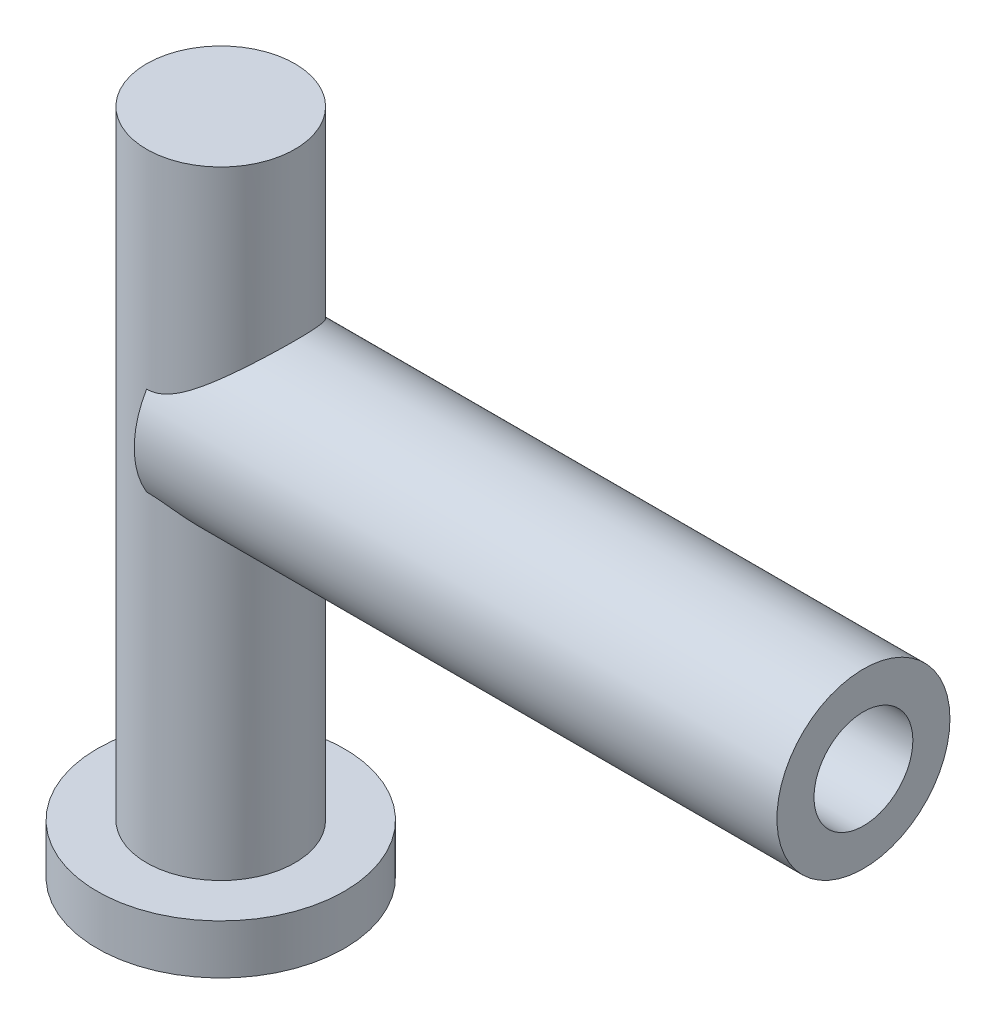
ISO-10303-21;
HEADER;
FILE_DESCRIPTION(('STEP AP214'),'2;1');
FILE_NAME('part.step','',(''),(''),'','','');
FILE_SCHEMA(('AUTOMOTIVE_DESIGN { 1 0 10303 214 1 1 1 1 }'));
ENDSEC;
DATA;
#1=APPLICATION_CONTEXT('core data for automotive mechanical design processes');
#2=APPLICATION_PROTOCOL_DEFINITION('international standard','automotive_design',2000,#1);
#3=PRODUCT_CONTEXT('',#1,'mechanical');
#4=PRODUCT('Part','Part','',(#3));
#5=PRODUCT_RELATED_PRODUCT_CATEGORY('part','',(#4));
#6=PRODUCT_DEFINITION_FORMATION('','',#4);
#7=PRODUCT_DEFINITION_CONTEXT('part definition',#1,'design');
#8=PRODUCT_DEFINITION('design','',#6,#7);
#9=PRODUCT_DEFINITION_SHAPE('','',#8);
#10=(LENGTH_UNIT() NAMED_UNIT(*) SI_UNIT(.MILLI.,.METRE.));
#11=(NAMED_UNIT(*) PLANE_ANGLE_UNIT() SI_UNIT($,.RADIAN.));
#12=(NAMED_UNIT(*) SI_UNIT($,.STERADIAN.) SOLID_ANGLE_UNIT());
#13=UNCERTAINTY_MEASURE_WITH_UNIT(LENGTH_MEASURE(1.E-05),#10,'distance_accuracy_value','');
#14=(GEOMETRIC_REPRESENTATION_CONTEXT(3) GLOBAL_UNCERTAINTY_ASSIGNED_CONTEXT((#13)) GLOBAL_UNIT_ASSIGNED_CONTEXT((#10,
#11,#12)) REPRESENTATION_CONTEXT('',''));
#15=CARTESIAN_POINT('',(0.,0.,0.));
#16=DIRECTION('',(0.,0.,1.));
#17=DIRECTION('',(1.,0.,0.));
#18=AXIS2_PLACEMENT_3D('',#15,#16,#17);
#19=CARTESIAN_POINT('',(0.,135.,0.));
#20=DIRECTION('',(0.,1.,0.));
#21=DIRECTION('',(-1.,0.,0.));
#22=AXIS2_PLACEMENT_3D('',#19,#20,#21);
#23=CYLINDRICAL_SURFACE('',#22,30.);
#24=CARTESIAN_POINT('',(-30.,12.9490466566481,0.));
#25=CARTESIAN_POINT('',(-29.9999998661981,12.9490467858325,-0.502432050357106));
#26=CARTESIAN_POINT('',(-29.9873512767924,12.9680047664271,-1.00486659291617));
#27=CARTESIAN_POINT('',(-29.9370754507124,13.0435379487039,-2.00562861223446));
#28=CARTESIAN_POINT('',(-29.8994480825663,13.1001133483795,-2.50395606736271));
#29=CARTESIAN_POINT('',(-29.8001252135495,13.2500463686513,-3.49278874290095));
#30=CARTESIAN_POINT('',(-29.7384203306489,13.3434183275139,-3.98329083644028));
#31=CARTESIAN_POINT('',(-29.5924098661005,13.5656071354852,-4.9527367018995));
#32=CARTESIAN_POINT('',(-29.5081040111715,13.6944244131837,-5.43168033398314));
#33=CARTESIAN_POINT('',(-29.3192451350848,13.9851261764357,-6.3726831529905));
#34=CARTESIAN_POINT('',(-29.2147907649452,14.1468497498239,-6.83481207132658));
#35=CARTESIAN_POINT('',(-28.987567335659,14.5018880191012,-7.74207070686117));
#36=CARTESIAN_POINT('',(-28.864798371266,14.6952025515497,-8.18720051199242));
#37=CARTESIAN_POINT('',(-28.6033482003015,15.1115085441732,-9.05844037609497));
#38=CARTESIAN_POINT('',(-28.4646675126728,15.3344990365384,-9.48455105472425));
#39=CARTESIAN_POINT('',(-28.1739113247129,15.8083268670823,-10.3162415378409));
#40=CARTESIAN_POINT('',(-28.0218342454823,16.059167488588,-10.7218189133778));
#41=CARTESIAN_POINT('',(-27.6935578417576,16.6093419870822,-11.544666651525));
#42=CARTESIAN_POINT('',(-27.5164065024113,16.9109841412892,-11.9600134544702));
#43=CARTESIAN_POINT('',(-27.1528656210948,17.5430427283214,-12.7638755092378));
#44=CARTESIAN_POINT('',(-26.9664756598522,17.8734604675724,-13.1523895414017));
#45=CARTESIAN_POINT('',(-26.5877396332004,18.5618771047251,-13.9021114634373));
#46=CARTESIAN_POINT('',(-26.3953859507486,18.9199122239919,-14.2632822184455));
#47=CARTESIAN_POINT('',(-26.0086530551826,19.6618251073262,-14.9568597365416));
#48=CARTESIAN_POINT('',(-25.8142737230125,20.0457043976866,-15.2892647981446));
#49=CARTESIAN_POINT('',(-25.396836648899,20.9008190632928,-15.9745417178036));
#50=CARTESIAN_POINT('',(-25.174096536266,21.3762773375354,-16.3223586443349));
#51=CARTESIAN_POINT('',(-24.7376939344547,22.3590808572125,-16.9764877633748));
#52=CARTESIAN_POINT('',(-24.5240335140448,22.8664333049997,-17.2827905315006));
#53=CARTESIAN_POINT('',(-24.1134541975623,23.9108542899367,-17.8511644026812));
#54=CARTESIAN_POINT('',(-23.9165127661254,24.4478811628406,-18.1132955295477));
#55=CARTESIAN_POINT('',(-23.5472211433069,25.5503367730226,-18.5908454263022));
#56=CARTESIAN_POINT('',(-23.3748591544977,26.1157517074476,-18.8062866319954));
#57=CARTESIAN_POINT('',(-23.1083554699939,27.1049974448942,-19.13202887715));
#58=CARTESIAN_POINT('',(-23.0059988256492,27.522566483143,-19.254726201792));
#59=CARTESIAN_POINT('',(-22.8211903176783,28.3689657415911,-19.4734126020971));
#60=CARTESIAN_POINT('',(-22.7387352052499,28.7977941110838,-19.5694060373963));
#61=CARTESIAN_POINT('',(-22.5966842761104,29.6638847339317,-19.7332623242764));
#62=CARTESIAN_POINT('',(-22.5370547106276,30.1011335239383,-19.8011667190628));
#63=CARTESIAN_POINT('',(-22.4427751867479,30.9818691856146,-19.9079619855319));
#64=CARTESIAN_POINT('',(-22.4081253652476,31.4253560914575,-19.9468526982109));
#65=CARTESIAN_POINT('',(-22.3651578047493,32.3170728539821,-19.995018995311));
#66=CARTESIAN_POINT('',(-22.3569497015248,32.7653147463807,-20.004171276088));
#67=CARTESIAN_POINT('',(-22.3675301691013,33.6610773153886,-19.9923398271623));
#68=CARTESIAN_POINT('',(-22.3863188316052,34.1085979895429,-19.971355995093));
#69=CARTESIAN_POINT('',(-22.4501086857202,34.9996717520401,-19.8996205096492));
#70=CARTESIAN_POINT('',(-22.4951293541334,35.4432216434202,-19.8488467375743));
#71=CARTESIAN_POINT('',(-22.6095581655225,36.3228215840411,-19.7184018881212));
#72=CARTESIAN_POINT('',(-22.6789667736164,36.7588714900785,-19.6387302596127));
#73=CARTESIAN_POINT('',(-22.8360020403641,37.6016526517218,-19.4558684710411));
#74=CARTESIAN_POINT('',(-22.9226794986437,38.0088246899546,-19.3538839737256));
#75=CARTESIAN_POINT('',(-23.1133089528255,38.8122825298098,-19.1258219416928));
#76=CARTESIAN_POINT('',(-23.2172676308142,39.208564051083,-18.9997350845369));
#77=CARTESIAN_POINT('',(-23.5509005263235,40.3789773277666,-18.5870898788947));
#78=CARTESIAN_POINT('',(-23.8024209013306,41.1351284508132,-18.2660472919538));
#79=CARTESIAN_POINT('',(-24.2342569329525,42.3013339233787,-17.6854431992285));
#80=CARTESIAN_POINT('',(-24.4030773177829,42.7293714716125,-17.4522559964646));
#81=CARTESIAN_POINT('',(-24.7497432705651,43.5647943008783,-16.9570483876589));
#82=CARTESIAN_POINT('',(-24.9275896995493,43.972177604177,-16.6950252280375));
#83=CARTESIAN_POINT('',(-25.2885468949721,44.7658013210802,-16.1430567151301));
#84=CARTESIAN_POINT('',(-25.4716632378859,45.1520179805102,-15.8530809594392));
#85=CARTESIAN_POINT('',(-25.8393965051977,45.9020855877797,-15.246358714758));
#86=CARTESIAN_POINT('',(-26.0240135285329,46.2659350472229,-14.9296104475491));
#87=CARTESIAN_POINT('',(-26.4310497738323,47.0463498537771,-14.1989483888887));
#88=CARTESIAN_POINT('',(-26.6530303956694,47.4573500244591,-13.7788159652825));
#89=CARTESIAN_POINT('',(-27.0885965336176,48.2427979996002,-12.9014676729698));
#90=CARTESIAN_POINT('',(-27.3021805000214,48.6172390753667,-12.4442450060577));
#91=CARTESIAN_POINT('',(-27.7153401348638,49.326564978796,-11.4946861176089));
#92=CARTESIAN_POINT('',(-27.9149260225621,49.6614787878065,-11.0023760522687));
#93=CARTESIAN_POINT('',(-28.2949676279155,50.2888118731227,-9.98447354240779));
#94=CARTESIAN_POINT('',(-28.4754286055528,50.5812428418608,-9.45889031296221));
#95=CARTESIAN_POINT('',(-28.7791644068811,51.0672372049617,-8.4833461227497));
#96=CARTESIAN_POINT('',(-28.9067147978732,51.2689442319853,-8.03875717640116));
#97=CARTESIAN_POINT('',(-29.1437173052015,51.6406698194511,-7.13185034835575));
#98=CARTESIAN_POINT('',(-29.2531715370476,51.8106920842584,-6.6695345467911));
#99=CARTESIAN_POINT('',(-29.4516277514227,52.1170404523184,-5.72992272771891));
#100=CARTESIAN_POINT('',(-29.5406434674396,52.2533891869002,-5.25263701566193));
#101=CARTESIAN_POINT('',(-29.6963305492252,52.4907990479044,-4.28575432400348));
#102=CARTESIAN_POINT('',(-29.7630015712691,52.5918596314958,-3.79615715514136));
#103=CARTESIAN_POINT('',(-29.8726578949709,52.7576199706144,-2.80597314349126));
#104=CARTESIAN_POINT('',(-29.9155383206477,52.8221587517845,-2.30534759903097));
#105=CARTESIAN_POINT('',(-29.9760956021539,52.9132012089964,-1.29911991465958));
#106=CARTESIAN_POINT('',(-29.9937724250504,52.9397048353385,-0.793517768246544));
#107=CARTESIAN_POINT('',(-30.0034717951188,52.9542546895085,0.218464736427038));
#108=CARTESIAN_POINT('',(-29.9954953996663,52.9423025024098,0.724845061752664));
#109=CARTESIAN_POINT('',(-29.9540933231667,52.8801341121421,1.73418156784463));
#110=CARTESIAN_POINT('',(-29.9206687283027,52.8299195420926,2.23713789383012));
#111=CARTESIAN_POINT('',(-29.8324414506934,52.6968779257794,3.20042176411032));
#112=CARTESIAN_POINT('',(-29.7793090042602,52.6165950018563,3.66125811656817));
#113=CARTESIAN_POINT('',(-29.6529106481444,52.4246807677952,4.57350157570507));
#114=CARTESIAN_POINT('',(-29.5796458717002,52.3130512221345,5.02490921158322));
#115=CARTESIAN_POINT('',(-29.4144446665675,52.0597444088362,5.91571607198155));
#116=CARTESIAN_POINT('',(-29.3225070223762,51.9180651850998,6.35511451265424));
#117=CARTESIAN_POINT('',(-29.1217004947068,51.6061545870712,7.21966385402623));
#118=CARTESIAN_POINT('',(-29.0128307093883,51.4359216919141,7.64481399436504));
#119=CARTESIAN_POINT('',(-28.7730488442419,51.0573618907148,8.50426678457441));
#120=CARTESIAN_POINT('',(-28.641201691667,50.8473533829713,8.9375669837223));
#121=CARTESIAN_POINT('',(-28.363103021114,50.3988764552911,9.78432512725704));
#122=CARTESIAN_POINT('',(-28.2168510697156,50.1604071789635,10.1977824740429));
#123=CARTESIAN_POINT('',(-27.9124418593604,49.6566708585115,11.0036909497809));
#124=CARTESIAN_POINT('',(-27.7542793038351,49.391391874134,11.3961325988641));
#125=CARTESIAN_POINT('',(-27.4287361682711,48.8357162183836,12.1587990167243));
#126=CARTESIAN_POINT('',(-27.2613545613897,48.5453167469595,12.529021301013));
#127=CARTESIAN_POINT('',(-26.8930879740092,47.8929995513677,13.3031347178692));
#128=CARTESIAN_POINT('',(-26.6910905163228,47.5270341316246,13.7030923841241));
#129=CARTESIAN_POINT('',(-26.2826982946006,46.765113154077,14.4709683638239));
#130=CARTESIAN_POINT('',(-26.0763029510258,46.3691536259622,14.8388824217615));
#131=CARTESIAN_POINT('',(-25.6635739697582,45.5484489806615,15.5417880165119));
#132=CARTESIAN_POINT('',(-25.4572404691787,45.1236844957861,15.876757023597));
#133=CARTESIAN_POINT('',(-25.0497261492331,44.2468112719767,16.5122275702686));
#134=CARTESIAN_POINT('',(-24.8485448051984,43.7947053332408,16.81273263041));
#135=CARTESIAN_POINT('',(-24.4733023029991,42.9035294042009,17.3538627139578));
#136=CARTESIAN_POINT('',(-24.2983863656876,42.4665896271533,17.5974024349064));
#137=CARTESIAN_POINT('',(-23.9619407246742,41.5714918573938,18.0528546349536));
#138=CARTESIAN_POINT('',(-23.8004112149102,41.113333557425,18.2647666558762));
#139=CARTESIAN_POINT('',(-23.4959190621918,40.1777080845106,18.6548371117046));
#140=CARTESIAN_POINT('',(-23.352929353255,39.700270424661,18.8330449293941));
#141=CARTESIAN_POINT('',(-23.0904591353034,38.7273214579476,19.1539484457238));
#142=CARTESIAN_POINT('',(-22.9709732247938,38.2318143347954,19.2966523056608));
#143=CARTESIAN_POINT('',(-22.7795445121487,37.3160293004886,19.5220414226083));
#144=CARTESIAN_POINT('',(-22.7029160837044,36.8982466693676,19.6109049179647));
#145=CARTESIAN_POINT('',(-22.5714513943608,36.0545153501045,19.7620762933325));
#146=CARTESIAN_POINT('',(-22.5166125085731,35.6285676520558,19.82438737206));
#147=CARTESIAN_POINT('',(-22.4307802243878,34.771537847478,19.9214537495162));
#148=CARTESIAN_POINT('',(-22.3997648547817,34.3404608450153,19.9562344390175));
#149=CARTESIAN_POINT('',(-22.3627151772862,33.4758656456945,19.9977438544737));
#150=CARTESIAN_POINT('',(-22.3566812339736,33.0423474133017,20.0044721710347));
#151=CARTESIAN_POINT('',(-22.3698449862022,32.1759313693192,19.9897505651309));
#152=CARTESIAN_POINT('',(-22.389057085506,31.7430340530927,19.9682845568072));
#153=CARTESIAN_POINT('',(-22.4519644396443,30.8813440408061,19.89752521375));
#154=CARTESIAN_POINT('',(-22.4956594937703,30.4525513111264,19.84823210714));
#155=CARTESIAN_POINT('',(-22.6059284972836,29.6014646871913,19.7225495457303));
#156=CARTESIAN_POINT('',(-22.672528474229,29.1791787596563,19.6461292623078));
#157=CARTESIAN_POINT('',(-22.8262602119976,28.3439654828719,19.4672984586528));
#158=CARTESIAN_POINT('',(-22.9133946099072,27.9310393431043,19.3648846001243));
#159=CARTESIAN_POINT('',(-23.1310818906606,27.0078149623273,19.1046848410163));
#160=CARTESIAN_POINT('',(-23.2670175183131,26.5008858880061,18.9394160062732));
#161=CARTESIAN_POINT('',(-23.5616278122302,25.5075701502435,18.5716220555324));
#162=CARTESIAN_POINT('',(-23.7203087439171,25.021189194942,18.369086669714));
#163=CARTESIAN_POINT('',(-24.0548494900775,24.0701868725302,17.928768029319));
#164=CARTESIAN_POINT('',(-24.2307275976469,23.6055894714747,17.6909470983742));
#165=CARTESIAN_POINT('',(-24.5941802563021,22.6998616789805,17.1820850766219));
#166=CARTESIAN_POINT('',(-24.781754189423,22.2587300499744,16.9110457402246));
#167=CARTESIAN_POINT('',(-25.1672255632098,21.3930011527054,16.3319905343255));
#168=CARTESIAN_POINT('',(-25.3652486390897,20.9688498081769,16.0233924051234));
#169=CARTESIAN_POINT('',(-25.7637225763061,20.146755786134,15.3745104302452));
#170=CARTESIAN_POINT('',(-25.9641734317233,19.7488130447341,15.03422666181));
#171=CARTESIAN_POINT('',(-26.3632502502893,18.9801936222388,14.3228973596636));
#172=CARTESIAN_POINT('',(-26.5618756733661,18.6095247966881,13.951843028237));
#173=CARTESIAN_POINT('',(-26.9531887772777,17.8970370296265,13.180017889376));
#174=CARTESIAN_POINT('',(-27.1458759630328,17.5552204894655,12.7792446136651));
#175=CARTESIAN_POINT('',(-27.5484327444244,16.8552738161282,11.88929534125));
#176=CARTESIAN_POINT('',(-27.7567878541468,16.5018678353836,11.3956949938792));
#177=CARTESIAN_POINT('',(-28.1549839321457,15.8384212548499,10.3729470334891));
#178=CARTESIAN_POINT('',(-28.3448221999975,15.5283869773681,9.84379425458729));
#179=CARTESIAN_POINT('',(-28.7002669540513,14.9558362185735,8.75345833781633));
#180=CARTESIAN_POINT('',(-28.8659031307225,14.6932614198746,8.19231563994949));
#181=CARTESIAN_POINT('',(-29.1680076078479,14.2192293488792,7.04137086874957));
#182=CARTESIAN_POINT('',(-29.3044861493111,14.007754125496,6.45157894748345));
#183=CARTESIAN_POINT('',(-29.5171038312657,13.6806485441157,5.38222751658731));
#184=CARTESIAN_POINT('',(-29.5999120726272,13.5541627082134,4.90728446450017));
#185=CARTESIAN_POINT('',(-29.7432935523992,13.3360332784478,3.94618639128294));
#186=CARTESIAN_POINT('',(-29.8038703786016,13.2443840624305,3.46003319276104));
#187=CARTESIAN_POINT('',(-29.9013488891663,13.0972532954016,2.48023551916964));
#188=CARTESIAN_POINT('',(-29.9382651667603,13.0417494504933,1.98659585428407));
#189=CARTESIAN_POINT('',(-29.9875912480541,12.9676453750214,0.995305041117392));
#190=CARTESIAN_POINT('',(-30.0000001325293,12.9490465286922,0.497653743070654));
#191=CARTESIAN_POINT('',(-30.,12.9490466566481,0.));
#192=B_SPLINE_CURVE_WITH_KNOTS('',3,(#24,#25,#26,#27,#28,#29,#30,#31,#32,#33,#34,#35,#36,#37,
#38,#39,#40,#41,#42,#43,#44,#45,#46,#47,#48,#49,#50,#51,#52,#53,#54,#55,#56,#57,#58,#59,#60,#61,
#62,#63,#64,#65,#66,#67,#68,#69,#70,#71,#72,#73,#74,#75,#76,#77,#78,#79,#80,#81,#82,#83,#84,#85,
#86,#87,#88,#89,#90,#91,#92,#93,#94,#95,#96,#97,#98,#99,#100,#101,#102,#103,#104,#105,#106,#107,
#108,#109,#110,#111,#112,#113,#114,#115,#116,#117,#118,#119,#120,#121,#122,#123,#124,#125,#126,
#127,#128,#129,#130,#131,#132,#133,#134,#135,#136,#137,#138,#139,#140,#141,#142,#143,#144,#145,
#146,#147,#148,#149,#150,#151,#152,#153,#154,#155,#156,#157,#158,#159,#160,#161,#162,#163,#164,
#165,#166,#167,#168,#169,#170,#171,#172,#173,#174,#175,#176,#177,#178,#179,#180,#181,#182,#183,
#184,#185,#186,#187,#188,#189,#190,#191),.UNSPECIFIED.,.T.,.F.,(4,2,2,2,2,2,2,2,2,2,2,2,2,2,2,2,
2,2,2,2,2,2,2,2,2,2,2,2,2,2,2,2,2,2,2,2,2,2,2,2,2,2,2,2,2,2,2,2,2,2,2,2,2,2,2,2,2,2,2,2,2,2,2,2,
2,2,2,2,2,2,2,2,2,2,2,2,2,2,2,2,2,2,2,4),(0.,1.50678860030269,3.01358513141216,4.52096938721657,
6.02837187047945,7.52857302893605,9.02876642612416,10.5289109101102,12.0292324383504,
13.6567444840869,15.284330458243,16.9140886133164,18.5439431024577,20.431131930561,
22.3187484658921,24.2037789087041,26.0879015235946,27.4279650999174,28.7678097709498,
30.1056656880386,31.4435289369311,32.7869323000986,34.1303402265694,35.4747468830929,
36.8191791810432,38.1037263431644,39.3887713582513,41.9574635192448,43.5039572638652,
45.0505988133526,46.5989419535986,48.1473880150574,50.029943114075,51.9128440463346,
53.7943557465544,55.6753486185392,57.1876211138398,58.699716693543,60.2107932404063,
61.7218930308517,63.2396023156496,64.7573135836025,66.2749622952646,67.7925462340978,
69.2033177886317,70.6140099478306,72.0247939649324,73.4356531490234,74.9318700392892,
76.4281319624119,77.9250632379934,79.4221615843148,81.1559974776003,82.8900632805819,
84.6253068106235,86.3603729242013,87.9487273830719,89.5371048494667,91.1231367124568,
92.7088036566569,94.0093258243475,95.3096912764256,96.6088560233589,97.9080397301251,
99.2079649891922,100.507879591774,101.809276234171,103.110840096639,104.759184673476,
106.407984179069,108.058557042328,109.70904276911,111.389510486189,113.069974106853,
114.750919862111,116.432005383304,118.354868197109,120.278011015838,122.198774401875,
124.118862046836,125.61242765333,127.105752116315,128.598154645697,130.090613151129),.UNSPECIFIED.);
#193=CARTESIAN_POINT('',(-30.,12.9490466566481,0.));
#194=VERTEX_POINT('',#193);
#195=EDGE_CURVE('E74',#194,#194,#192,.T.);
#196=ORIENTED_EDGE('',*,*,#195,.T.);
#197=EDGE_LOOP('',(#196));
#198=FACE_BOUND('',#197,.T.);
#199=CARTESIAN_POINT('',(0.,-115.,0.));
#200=DIRECTION('',(0.,1.,0.));
#201=DIRECTION('',(-1.,0.,0.));
#202=AXIS2_PLACEMENT_3D('',#199,#200,#201);
#203=CIRCLE('',#202,29.9999999999999);
#204=CARTESIAN_POINT('',(-29.9999999999999,-115.,0.));
#205=VERTEX_POINT('',#204);
#206=EDGE_CURVE('E79',#205,#205,#203,.T.);
#207=ORIENTED_EDGE('',*,*,#206,.T.);
#208=EDGE_LOOP('',(#207));
#209=FACE_BOUND('',#208,.T.);
#210=CARTESIAN_POINT('',(0.,135.,0.));
#211=DIRECTION('',(0.,1.,0.));
#212=DIRECTION('',(-1.,0.,0.));
#213=AXIS2_PLACEMENT_3D('',#210,#211,#212);
#214=CIRCLE('',#213,30.);
#215=CARTESIAN_POINT('',(-30.,135.,0.));
#216=VERTEX_POINT('',#215);
#217=EDGE_CURVE('E72',#216,#216,#214,.T.);
#218=ORIENTED_EDGE('',*,*,#217,.F.);
#219=EDGE_LOOP('',(#218));
#220=FACE_BOUND('',#219,.T.);
#221=DIRECTION('',(0.,1.,0.));
#222=VECTOR('',#221,1.);
#223=CARTESIAN_POINT('',(0.,135.,-30.));
#224=LINE('',#223,#222);
#225=CARTESIAN_POINT('',(0.,14.9212902793281,-30.));
#226=VERTEX_POINT('',#225);
#227=CARTESIAN_POINT('',(0.,50.9768030339681,-30.));
#228=VERTEX_POINT('',#227);
#229=EDGE_CURVE('E11',#226,#228,#224,.T.);
#230=ORIENTED_EDGE('',*,*,#229,.F.);
#231=CARTESIAN_POINT('',(0.,14.9212902793281,30.));
#232=CARTESIAN_POINT('',(0.254843531044269,14.9213181036984,30.0000085070818));
#233=CARTESIAN_POINT('',(0.50967654767122,14.9158872307409,29.9967529791874));
#234=CARTESIAN_POINT('',(1.01868418624149,14.8943149475806,29.9837781414388));
#235=CARTESIAN_POINT('',(1.27285890777247,14.8781752654775,29.9740598744879));
#236=CARTESIAN_POINT('',(1.7794638197443,14.8354369265777,29.9482508797765));
#237=CARTESIAN_POINT('',(2.03189654982502,14.8088602587778,29.9321735490007));
#238=CARTESIAN_POINT('',(2.53500628157639,14.7456421272565,29.8937689720393));
#239=CARTESIAN_POINT('',(2.78568322697466,14.709000342451,29.8714415264704));
#240=CARTESIAN_POINT('',(3.52646289702339,14.5859954926428,29.7961005029997));
#241=CARTESIAN_POINT('',(4.01346160258733,14.4858345497939,29.7343029722881));
#242=CARTESIAN_POINT('',(4.97628277782048,14.2529328348666,29.5884118712677));
#243=CARTESIAN_POINT('',(5.45209827775917,14.1201723063009,29.5043047780958));
#244=CARTESIAN_POINT('',(6.59194195786552,13.7644706047167,29.2747991649151));
#245=CARTESIAN_POINT('',(7.24934601732068,13.5272535803141,29.11857583661));
#246=CARTESIAN_POINT('',(8.53670604785339,13.0109688079425,28.7675240552719));
#247=CARTESIAN_POINT('',(9.16664964869495,12.7318824452713,28.5726784186935));
#248=CARTESIAN_POINT('',(10.4050977924853,12.1411785429944,28.1454556592296));
#249=CARTESIAN_POINT('',(11.013368111416,11.8292990858817,27.9127667352184));
#250=CARTESIAN_POINT('',(12.2040467749242,11.1846671635494,27.4131010482927));
#251=CARTESIAN_POINT('',(12.7864561596239,10.8519155391058,27.1461256660574));
#252=CARTESIAN_POINT('',(13.7894395728221,10.2548184395481,26.6474181948813));
#253=CARTESIAN_POINT('',(14.2152113646829,9.99329632426042,26.4226810871856));
#254=CARTESIAN_POINT('',(15.0531473959005,9.46519293671469,25.9544434565541));
#255=CARTESIAN_POINT('',(15.4653103899295,9.19861120495188,25.7109412231999));
#256=CARTESIAN_POINT('',(16.2764283315277,8.66264231784194,25.2052843140871));
#257=CARTESIAN_POINT('',(16.6753783076769,8.39325415557688,24.9431227319637));
#258=CARTESIAN_POINT('',(17.4600324905541,7.85379414967139,24.400303675515));
#259=CARTESIAN_POINT('',(17.8457354564748,7.58372224451693,24.1196444757221));
#260=CARTESIAN_POINT('',(18.9810103092381,6.77663826654429,23.251408341501));
#261=CARTESIAN_POINT('',(19.7109381394293,6.24129014796291,22.6362069589));
#262=CARTESIAN_POINT('',(21.1153264403236,5.18861172332638,21.3321466709154));
#263=CARTESIAN_POINT('',(21.7898099054407,4.67127399967268,20.6433185761378));
#264=CARTESIAN_POINT('',(22.9354367604098,3.77823847459407,19.3529182931281));
#265=CARTESIAN_POINT('',(23.4184587910875,3.39661287559915,18.7659725985148));
#266=CARTESIAN_POINT('',(24.3449221228651,2.65717781551231,17.5473781650169));
#267=CARTESIAN_POINT('',(24.7883646785699,2.299367599603,16.9157308442398));
#268=CARTESIAN_POINT('',(25.6311292813582,1.61384553322464,15.6092538538372));
#269=CARTESIAN_POINT('',(26.0304987779504,1.28610137877639,14.9344718847029));
#270=CARTESIAN_POINT('',(26.780879390746,0.666377041293589,13.5428583282771));
#271=CARTESIAN_POINT('',(27.1318998525571,0.374389947825666,12.8260349056735));
#272=CARTESIAN_POINT('',(27.721630428329,-0.118575106271851,11.4867477471679));
#273=CARTESIAN_POINT('',(27.9691677420232,-0.326458744832106,10.8707020744823));
#274=CARTESIAN_POINT('',(28.4253577124856,-0.710808561217858,9.61484157940477));
#275=CARTESIAN_POINT('',(28.6340145430345,-0.887278111223237,8.97502931718636));
#276=CARTESIAN_POINT('',(29.0094855008969,-1.20560663239144,7.67510290547269));
#277=CARTESIAN_POINT('',(29.1763179038312,-1.34748071966006,7.0149977652125));
#278=CARTESIAN_POINT('',(29.4656591271573,-1.59396017597902,5.67824964814185));
#279=CARTESIAN_POINT('',(29.5881674502048,-1.69856512684573,5.0016064858552));
#280=CARTESIAN_POINT('',(29.787236414982,-1.86871843236135,3.63328937606357));
#281=CARTESIAN_POINT('',(29.8635707842186,-1.93407443902697,2.94155834786363));
#282=CARTESIAN_POINT('',(29.9679416247089,-2.0234682203005,1.55178371127654));
#283=CARTESIAN_POINT('',(29.9959779907175,-2.04750590487262,0.853740089137105));
#284=CARTESIAN_POINT('',(30.0032159182893,-2.05370984792774,-0.542725184199554));
#285=CARTESIAN_POINT('',(29.9824216067935,-2.03587964488917,-1.24114679846302));
#286=CARTESIAN_POINT('',(29.8924036182641,-1.95876411607348,-2.63252126579066));
#287=CARTESIAN_POINT('',(29.8231820824125,-1.89948062312975,-3.3254743592725));
#288=CARTESIAN_POINT('',(29.6447875056795,-1.74693979237941,-4.64719380166904));
#289=CARTESIAN_POINT('',(29.5391132397213,-1.65666023282665,-5.27678381196608));
#290=CARTESIAN_POINT('',(29.2892332874524,-1.44361132668715,-6.52260790460566));
#291=CARTESIAN_POINT('',(29.145030035609,-1.3208440328538,-7.13884282813525));
#292=CARTESIAN_POINT('',(28.8200664373816,-1.04490673769371,-8.35462647132855));
#293=CARTESIAN_POINT('',(28.6393039725067,-0.891734974533519,-8.95417422173184));
#294=CARTESIAN_POINT('',(28.243463736127,-0.557400773170802,-10.1337994217654));
#295=CARTESIAN_POINT('',(28.0283838302645,-0.37623659401482,-10.7138756576559));
#296=CARTESIAN_POINT('',(27.5486587875981,0.0262539144206665,-11.8957356673395));
#297=CARTESIAN_POINT('',(27.2814862375127,0.249588225377693,-12.4958077943723));
#298=CARTESIAN_POINT('',(26.713052565081,0.72231452891295,-13.668858828762));
#299=CARTESIAN_POINT('',(26.4117906408154,0.971707134476625,-14.2418370983126));
#300=CARTESIAN_POINT('',(25.7778033901021,1.49332125840664,-15.3596202142414));
#301=CARTESIAN_POINT('',(25.4450633470028,1.76555344793882,-15.9044116967744));
#302=CARTESIAN_POINT('',(24.7506812765953,2.32952393322307,-16.9648326162562));
#303=CARTESIAN_POINT('',(24.3890333952217,2.62126617795101,-17.4804561101704));
#304=CARTESIAN_POINT('',(23.73225145794,3.1465109322211,-18.3575971183513));
#305=CARTESIAN_POINT('',(23.442897828246,3.3764882498578,-18.7255902152965));
#306=CARTESIAN_POINT('',(22.8500082202971,3.84424017373738,-19.4446449109201));
#307=CARTESIAN_POINT('',(22.5464745463998,4.08201351121223,-19.7957092419291));
#308=CARTESIAN_POINT('',(21.6152824212986,4.80536174709067,-20.8239094432575));
#309=CARTESIAN_POINT('',(20.9671981872822,5.3008318019212,-21.4758328132063));
#310=CARTESIAN_POINT('',(19.6196421938524,6.30829752793442,-22.7136273957622));
#311=CARTESIAN_POINT('',(18.9200617156107,6.82032680342157,-23.2993518370874));
#312=CARTESIAN_POINT('',(17.4728013316754,7.84847331553628,-24.4034732282811));
#313=CARTESIAN_POINT('',(16.7251362071826,8.36458925355095,-24.9218907217498));
#314=CARTESIAN_POINT('',(15.341990465066,9.28118865256894,-25.7903898466072));
#315=CARTESIAN_POINT('',(14.7155162376557,9.68339752590746,-26.1530580020466));
#316=CARTESIAN_POINT('',(13.4308563925656,10.4739230320685,-26.8354474291592));
#317=CARTESIAN_POINT('',(12.7726656125418,10.8622373853042,-27.1551616771418));
#318=CARTESIAN_POINT('',(11.4243747193044,11.6135487550861,-27.7493303175956));
#319=CARTESIAN_POINT('',(10.7343501954095,11.9766010814032,-28.0238855055935));
#320=CARTESIAN_POINT('',(9.31904267049935,12.6645102147757,-28.5257514096351));
#321=CARTESIAN_POINT('',(8.5937838860242,12.9893927453573,-28.7530940235809));
#322=CARTESIAN_POINT('',(7.39034407545808,13.4698331766859,-29.079371382842));
#323=CARTESIAN_POINT('',(6.92337281983989,13.6427263003208,-29.1942183946081));
#324=CARTESIAN_POINT('',(5.9756742453121,13.9619548484927,-29.4028343026627));
#325=CARTESIAN_POINT('',(5.49494645574703,14.1082893631134,-29.4966024768018));
#326=CARTESIAN_POINT('',(4.52278709658416,14.3684867434937,-29.6611951339551));
#327=CARTESIAN_POINT('',(4.03140147819813,14.482467235814,-29.7321028597307));
#328=CARTESIAN_POINT('',(3.03882485368795,14.6734418762328,-29.8498734418043));
#329=CARTESIAN_POINT('',(2.53764060641164,14.7504606436628,-29.8967523045806));
#330=CARTESIAN_POINT('',(1.69663517245532,14.844721206621,-29.9538874329307));
#331=CARTESIAN_POINT('',(1.35852472909167,14.8733216873099,-29.9711365276115));
#332=CARTESIAN_POINT('',(0.680302448809454,14.9116602434004,-29.9942133430266));
#333=CARTESIAN_POINT('',(0.340188254617546,14.9213676373685,-30.000022486029));
#334=CARTESIAN_POINT('',(0.,14.9212902793281,-30.));
#335=B_SPLINE_CURVE_WITH_KNOTS('',3,(#231,#232,#233,#234,#235,#236,#237,#238,#239,#240,#241,
#242,#243,#244,#245,#246,#247,#248,#249,#250,#251,#252,#253,#254,#255,#256,#257,#258,#259,#260,
#261,#262,#263,#264,#265,#266,#267,#268,#269,#270,#271,#272,#273,#274,#275,#276,#277,#278,#279,
#280,#281,#282,#283,#284,#285,#286,#287,#288,#289,#290,#291,#292,#293,#294,#295,#296,#297,#298,
#299,#300,#301,#302,#303,#304,#305,#306,#307,#308,#309,#310,#311,#312,#313,#314,#315,#316,#317,
#318,#319,#320,#321,#322,#323,#324,#325,#326,#327,#328,#329,#330,#331,#332,#333,#334),
.UNSPECIFIED.,.F.,.F.,(4,2,2,2,2,2,2,2,2,2,2,2,2,2,2,2,2,2,2,2,2,2,2,2,2,2,2,2,2,2,2,2,2,2,2,2,
2,2,2,2,2,2,2,2,2,2,2,2,2,2,2,4),(0.,0.764434366581873,1.52874540500382,2.29145473205786,
3.05418839288966,4.55517955078983,6.05708261659473,8.20191919162937,10.3477121817195,
12.5121751459236,14.676550976818,16.3197197190176,17.9630384115914,19.6069685391002,
21.2510522309295,24.5303393796746,27.8082595766874,30.3577456825969,32.9071509452256,
35.4537841493176,37.9999244100677,40.0850080617102,42.1698677526063,44.2538148481554,
46.3377853261924,48.4318871353074,50.5259935076242,52.6199229022148,54.7137597207746,
56.6458709080767,58.577860043125,60.509961162936,62.4421824957741,64.5215690586894,
66.6010045473231,68.681417063952,70.7622519530983,72.32643077543,73.8903562858858,
77.0191205212335,80.154690901315,83.2893019732534,85.7720119485417,88.2551273960886,
90.7326229988381,93.2084392634621,94.7404261011707,96.2724654159115,97.7988613304166,
99.3242391326934,100.342829177059,101.36307198533),.UNSPECIFIED.);
#336=CARTESIAN_POINT('',(0.,14.9212902793281,30.));
#337=VERTEX_POINT('',#336);
#338=EDGE_CURVE('E41',#337,#226,#335,.T.);
#339=ORIENTED_EDGE('',*,*,#338,.F.);
#340=DIRECTION('',(0.,1.,0.));
#341=VECTOR('',#340,1.);
#342=CARTESIAN_POINT('',(0.,135.,30.));
#343=LINE('',#342,#341);
#344=CARTESIAN_POINT('',(0.,50.9768030339681,30.));
#345=VERTEX_POINT('',#344);
#346=EDGE_CURVE('E56',#345,#337,#343,.F.);
#347=ORIENTED_EDGE('',*,*,#346,.F.);
#348=CARTESIAN_POINT('',(0.,50.9768030339681,-30.));
#349=CARTESIAN_POINT('',(0.254843531044256,50.9767752095978,-30.0000085070818));
#350=CARTESIAN_POINT('',(0.509676547671208,50.9822060825552,-29.9967529791874));
#351=CARTESIAN_POINT('',(1.01868418624148,51.0037783657156,-29.9837781414388));
#352=CARTESIAN_POINT('',(1.27285890777245,51.0199180478187,-29.9740598744879));
#353=CARTESIAN_POINT('',(1.77946381974429,51.0626563867184,-29.9482508797765));
#354=CARTESIAN_POINT('',(2.031896549825,51.0892330545183,-29.9321735490007));
#355=CARTESIAN_POINT('',(2.53500628157638,51.1524511860396,-29.8937689720393));
#356=CARTESIAN_POINT('',(2.78568322697464,51.1890929708452,-29.8714415264704));
#357=CARTESIAN_POINT('',(3.52646289702338,51.3120978206534,-29.7961005029997));
#358=CARTESIAN_POINT('',(4.01346160258731,51.4122587635023,-29.7343029722881));
#359=CARTESIAN_POINT('',(4.97628277782046,51.6451604784295,-29.5884118712677));
#360=CARTESIAN_POINT('',(5.45209827775916,51.7779210069952,-29.5043047780958));
#361=CARTESIAN_POINT('',(6.5919419578655,52.1336227085794,-29.2747991649151));
#362=CARTESIAN_POINT('',(7.24934601732066,52.370839732982,-29.11857583661));
#363=CARTESIAN_POINT('',(8.53670604785338,52.8871245053537,-28.7675240552719));
#364=CARTESIAN_POINT('',(9.16664964869493,53.1662108680249,-28.5726784186935));
#365=CARTESIAN_POINT('',(10.4050977924853,53.7569147703017,-28.1454556592296));
#366=CARTESIAN_POINT('',(11.013368111416,54.0687942274145,-27.9127667352184));
#367=CARTESIAN_POINT('',(12.2040467749242,54.7134261497467,-27.4131010482927));
#368=CARTESIAN_POINT('',(12.7864561596239,55.0461777741904,-27.1461256660574));
#369=CARTESIAN_POINT('',(13.7894395728221,55.6432748737481,-26.6474181948813));
#370=CARTESIAN_POINT('',(14.2152113646829,55.9047969890357,-26.4226810871856));
#371=CARTESIAN_POINT('',(15.0531473959005,56.4329003765815,-25.9544434565541));
#372=CARTESIAN_POINT('',(15.4653103899295,56.6994821083443,-25.7109412231999));
#373=CARTESIAN_POINT('',(16.2764283315277,57.2354509954542,-25.2052843140871));
#374=CARTESIAN_POINT('',(16.6753783076769,57.5048391577193,-24.9431227319637));
#375=CARTESIAN_POINT('',(17.4600324905541,58.0442991636248,-24.400303675515));
#376=CARTESIAN_POINT('',(17.8457354564747,58.3143710687792,-24.1196444757221));
#377=CARTESIAN_POINT('',(18.981010309238,59.1214550467519,-23.251408341501));
#378=CARTESIAN_POINT('',(19.7109381394293,59.6568031653333,-22.6362069589));
#379=CARTESIAN_POINT('',(21.1153264403236,60.7094815899698,-21.3321466709154));
#380=CARTESIAN_POINT('',(21.7898099054406,61.2268193136235,-20.6433185761378));
#381=CARTESIAN_POINT('',(22.9354367604098,62.1198548387021,-19.3529182931281));
#382=CARTESIAN_POINT('',(23.4184587910875,62.501480437697,-18.7659725985148));
#383=CARTESIAN_POINT('',(24.3449221228651,63.2409154977839,-17.5473781650169));
#384=CARTESIAN_POINT('',(24.7883646785699,63.5987257136932,-16.9157308442398));
#385=CARTESIAN_POINT('',(25.6311292813582,64.2842477800715,-15.6092538538373));
#386=CARTESIAN_POINT('',(26.0304987779503,64.6119919345198,-14.9344718847029));
#387=CARTESIAN_POINT('',(26.780879390746,65.2317162720026,-13.5428583282771));
#388=CARTESIAN_POINT('',(27.1318998525571,65.5237033654705,-12.8260349056735));
#389=CARTESIAN_POINT('',(27.7216304283289,66.016668419568,-11.4867477471679));
#390=CARTESIAN_POINT('',(27.9691677420232,66.2245520581283,-10.8707020744823));
#391=CARTESIAN_POINT('',(28.4253577124855,66.608901874514,-9.61484157940478));
#392=CARTESIAN_POINT('',(28.6340145430345,66.7853714245194,-8.97502931718637));
#393=CARTESIAN_POINT('',(29.0094855008969,67.1036999456876,-7.6751029054727));
#394=CARTESIAN_POINT('',(29.1763179038312,67.2455740329562,-7.0149977652125));
#395=CARTESIAN_POINT('',(29.4656591271573,67.4920534892752,-5.67824964814185));
#396=CARTESIAN_POINT('',(29.5881674502048,67.5966584401419,-5.0016064858552));
#397=CARTESIAN_POINT('',(29.787236414982,67.7668117456575,-3.63328937606357));
#398=CARTESIAN_POINT('',(29.8635707842186,67.8321677523231,-2.94155834786363));
#399=CARTESIAN_POINT('',(29.9679416247088,67.9215615335967,-1.55178371127654));
#400=CARTESIAN_POINT('',(29.9959779907175,67.9455992181688,-0.853740089137101));
#401=CARTESIAN_POINT('',(30.0032159182893,67.9518031612239,0.542725184199558));
#402=CARTESIAN_POINT('',(29.9824216067934,67.9339729581853,1.24114679846302));
#403=CARTESIAN_POINT('',(29.8924036182641,67.8568574293696,2.63252126579066));
#404=CARTESIAN_POINT('',(29.8231820824125,67.7975739364259,3.3254743592725));
#405=CARTESIAN_POINT('',(29.6447875056795,67.6450331056756,4.64719380166904));
#406=CARTESIAN_POINT('',(29.5391132397213,67.5547535461228,5.27678381196608));
#407=CARTESIAN_POINT('',(29.2892332874524,67.3417046399833,6.52260790460566));
#408=CARTESIAN_POINT('',(29.145030035609,67.21893734615,7.13884282813525));
#409=CARTESIAN_POINT('',(28.8200664373816,66.9430000509899,8.35462647132855));
#410=CARTESIAN_POINT('',(28.6393039725067,66.7898282878297,8.95417422173184));
#411=CARTESIAN_POINT('',(28.2434637361269,66.4554940864669,10.1337994217655));
#412=CARTESIAN_POINT('',(28.0283838302645,66.274329907311,10.7138756576559));
#413=CARTESIAN_POINT('',(27.5486587875981,65.8718393988755,11.8957356673395));
#414=CARTESIAN_POINT('',(27.2814862375127,65.6485050879185,12.4958077943723));
#415=CARTESIAN_POINT('',(26.713052565081,65.1757787843832,13.668858828762));
#416=CARTESIAN_POINT('',(26.4117906408153,64.9263861788195,14.2418370983126));
#417=CARTESIAN_POINT('',(25.7778033901021,64.4047720548895,15.3596202142414));
#418=CARTESIAN_POINT('',(25.4450633470028,64.1325398653573,15.9044116967744));
#419=CARTESIAN_POINT('',(24.7506812765953,63.5685693800731,16.9648326162562));
#420=CARTESIAN_POINT('',(24.3890333952217,63.2768271353452,17.4804561101704));
#421=CARTESIAN_POINT('',(23.7322514579399,62.7515823810751,18.3575971183513));
#422=CARTESIAN_POINT('',(23.442897828246,62.5216050634383,18.7255902152965));
#423=CARTESIAN_POINT('',(22.8500082202971,62.0538531395588,19.4446449109201));
#424=CARTESIAN_POINT('',(22.5464745463998,61.8160798020839,19.7957092419291));
#425=CARTESIAN_POINT('',(21.6152824212985,61.0927315662055,20.8239094432575));
#426=CARTESIAN_POINT('',(20.9671981872822,60.597261511375,21.4758328132064));
#427=CARTESIAN_POINT('',(19.6196421938524,59.5897957853617,22.7136273957622));
#428=CARTESIAN_POINT('',(18.9200617156107,59.0777665098746,23.2993518370874));
#429=CARTESIAN_POINT('',(17.4728013316754,58.0496199977599,24.4034732282811));
#430=CARTESIAN_POINT('',(16.7251362071826,57.5335040597452,24.9218907217498));
#431=CARTESIAN_POINT('',(15.341990465066,56.6169046607272,25.7903898466072));
#432=CARTESIAN_POINT('',(14.7155162376557,56.2146957873887,26.1530580020466));
#433=CARTESIAN_POINT('',(13.4308563925656,55.4241702812277,26.8354474291591));
#434=CARTESIAN_POINT('',(12.7726656125417,55.035855927992,27.1551616771418));
#435=CARTESIAN_POINT('',(11.4243747193044,54.2845445582101,27.7493303175956));
#436=CARTESIAN_POINT('',(10.7343501954095,53.921492231893,28.0238855055935));
#437=CARTESIAN_POINT('',(9.31904267049933,53.2335830985204,28.5257514096351));
#438=CARTESIAN_POINT('',(8.59378388602418,52.9087005679389,28.7530940235809));
#439=CARTESIAN_POINT('',(7.39034407545806,52.4282601366103,29.079371382842));
#440=CARTESIAN_POINT('',(6.92337281983987,52.2553670129754,29.1942183946081));
#441=CARTESIAN_POINT('',(5.97567424531208,51.9361384648034,29.4028343026627));
#442=CARTESIAN_POINT('',(5.49494645574701,51.7898039501827,29.4966024768018));
#443=CARTESIAN_POINT('',(4.52278709658414,51.5296065698024,29.6611951339551));
#444=CARTESIAN_POINT('',(4.03140147819812,51.4156260774822,29.7321028597307));
#445=CARTESIAN_POINT('',(3.03882485368794,51.2246514370633,29.8498734418043));
#446=CARTESIAN_POINT('',(2.53764060641163,51.1476326696333,29.8967523045806));
#447=CARTESIAN_POINT('',(1.6966351724553,51.0533721066752,29.9538874329307));
#448=CARTESIAN_POINT('',(1.35852472909165,51.0247716259862,29.9711365276115));
#449=CARTESIAN_POINT('',(0.680302448809436,50.9864330698957,29.9942133430266));
#450=CARTESIAN_POINT('',(0.340188254617531,50.9767256759276,30.000022486029));
#451=CARTESIAN_POINT('',(0.,50.9768030339681,30.));
#452=B_SPLINE_CURVE_WITH_KNOTS('',3,(#348,#349,#350,#351,#352,#353,#354,#355,#356,#357,#358,
#359,#360,#361,#362,#363,#364,#365,#366,#367,#368,#369,#370,#371,#372,#373,#374,#375,#376,#377,
#378,#379,#380,#381,#382,#383,#384,#385,#386,#387,#388,#389,#390,#391,#392,#393,#394,#395,#396,
#397,#398,#399,#400,#401,#402,#403,#404,#405,#406,#407,#408,#409,#410,#411,#412,#413,#414,#415,
#416,#417,#418,#419,#420,#421,#422,#423,#424,#425,#426,#427,#428,#429,#430,#431,#432,#433,#434,
#435,#436,#437,#438,#439,#440,#441,#442,#443,#444,#445,#446,#447,#448,#449,#450,#451),
.UNSPECIFIED.,.F.,.F.,(4,2,2,2,2,2,2,2,2,2,2,2,2,2,2,2,2,2,2,2,2,2,2,2,2,2,2,2,2,2,2,2,2,2,2,2,
2,2,2,2,2,2,2,2,2,2,2,2,2,2,2,4),(0.,0.764434366581872,1.52874540500382,2.29145473205786,
3.05418839288965,4.55517955078983,6.05708261659472,8.20191919162936,10.3477121817195,
12.5121751459236,14.676550976818,16.3197197190176,17.9630384115914,19.6069685391002,
21.2510522309294,24.5303393796746,27.8082595766874,30.3577456825969,32.9071509452256,
35.4537841493176,37.9999244100677,40.0850080617102,42.1698677526063,44.2538148481554,
46.3377853261924,48.4318871353074,50.5259935076242,52.6199229022148,54.7137597207746,
56.6458709080767,58.577860043125,60.509961162936,62.4421824957741,64.5215690586894,
66.6010045473231,68.681417063952,70.7622519530983,72.32643077543,73.8903562858859,
77.0191205212335,80.154690901315,83.2893019732534,85.7720119485417,88.2551273960886,
90.7326229988381,93.2084392634621,94.7404261011707,96.2724654159114,97.7988613304166,
99.3242391326934,100.342829177059,101.36307198533),.UNSPECIFIED.);
#453=EDGE_CURVE('E51',#228,#345,#452,.T.);
#454=ORIENTED_EDGE('',*,*,#453,.F.);
#455=EDGE_LOOP('',(#230,#339,#347,#454));
#456=FACE_BOUND('',#455,.T.);
#457=ADVANCED_FACE('F33',(#198,#209,#220,#456),#23,.T.);
#458=CARTESIAN_POINT('',(30.,135.,0.));
#459=DIRECTION('',(0.,-1.,0.));
#460=DIRECTION('',(1.,0.,0.));
#461=AXIS2_PLACEMENT_3D('',#458,#459,#460);
#462=PLANE('',#461);
#463=ORIENTED_EDGE('',*,*,#217,.T.);
#464=EDGE_LOOP('',(#463));
#465=FACE_BOUND('',#464,.T.);
#466=ADVANCED_FACE('F35',(#465),#462,.F.);
#467=CARTESIAN_POINT('',(0.,-135.,0.));
#468=DIRECTION('',(0.,1.,0.));
#469=DIRECTION('',(-1.,0.,0.));
#470=AXIS2_PLACEMENT_3D('',#467,#468,#469);
#471=PLANE('',#470);
#472=CARTESIAN_POINT('',(0.,-135.,0.));
#473=DIRECTION('',(0.,1.,0.));
#474=DIRECTION('',(-1.,0.,0.));
#475=AXIS2_PLACEMENT_3D('',#472,#473,#474);
#476=CIRCLE('',#475,50.);
#477=CARTESIAN_POINT('',(-50.,-135.,0.));
#478=VERTEX_POINT('',#477);
#479=EDGE_CURVE('E65',#478,#478,#476,.T.);
#480=ORIENTED_EDGE('',*,*,#479,.F.);
#481=EDGE_LOOP('',(#480));
#482=FACE_BOUND('',#481,.T.);
#483=ADVANCED_FACE('F137',(#482),#471,.F.);
#484=CARTESIAN_POINT('',(0.,135.,0.));
#485=DIRECTION('',(0.,1.,0.));
#486=DIRECTION('',(-1.,0.,0.));
#487=AXIS2_PLACEMENT_3D('',#484,#485,#486);
#488=CYLINDRICAL_SURFACE('',#487,50.);
#489=CARTESIAN_POINT('',(0.,-115.,0.));
#490=DIRECTION('',(0.,1.,0.));
#491=DIRECTION('',(-1.,0.,0.));
#492=AXIS2_PLACEMENT_3D('',#489,#490,#491);
#493=CIRCLE('',#492,50.);
#494=CARTESIAN_POINT('',(-50.,-115.,0.));
#495=VERTEX_POINT('',#494);
#496=EDGE_CURVE('E82',#495,#495,#493,.T.);
#497=ORIENTED_EDGE('',*,*,#496,.F.);
#498=EDGE_LOOP('',(#497));
#499=FACE_BOUND('',#498,.T.);
#500=ORIENTED_EDGE('',*,*,#479,.T.);
#501=EDGE_LOOP('',(#500));
#502=FACE_BOUND('',#501,.T.);
#503=ADVANCED_FACE('F141',(#499,#502),#488,.T.);
#504=CARTESIAN_POINT('',(50.,-115.,0.));
#505=DIRECTION('',(0.,-1.,0.));
#506=DIRECTION('',(1.,0.,0.));
#507=AXIS2_PLACEMENT_3D('',#504,#505,#506);
#508=PLANE('',#507);
#509=ORIENTED_EDGE('',*,*,#206,.F.);
#510=EDGE_LOOP('',(#509));
#511=FACE_BOUND('',#510,.T.);
#512=ORIENTED_EDGE('',*,*,#496,.T.);
#513=EDGE_LOOP('',(#512));
#514=FACE_BOUND('',#513,.T.);
#515=ADVANCED_FACE('F103',(#511,#514),#508,.F.);
#516=CARTESIAN_POINT('',(260.,32.9490466566481,0.));
#517=DIRECTION('',(-1.,0.,0.));
#518=DIRECTION('',(0.,0.,1.));
#519=AXIS2_PLACEMENT_3D('',#516,#517,#518);
#520=CYLINDRICAL_SURFACE('',#519,35.);
#521=CARTESIAN_POINT('',(260.,32.9490466566481,0.));
#522=DIRECTION('',(1.,0.,0.));
#523=DIRECTION('',(0.,0.,-1.));
#524=AXIS2_PLACEMENT_3D('',#521,#522,#523);
#525=CIRCLE('',#524,35.);
#526=CARTESIAN_POINT('',(260.,32.9490466566481,-35.));
#527=VERTEX_POINT('',#526);
#528=EDGE_CURVE('E68',#527,#527,#525,.T.);
#529=ORIENTED_EDGE('',*,*,#528,.F.);
#530=EDGE_LOOP('',(#529));
#531=FACE_BOUND('',#530,.T.);
#532=CARTESIAN_POINT('',(0.,32.9490466566481,0.));
#533=DIRECTION('',(1.,0.,0.));
#534=DIRECTION('',(0.,0.,-1.));
#535=AXIS2_PLACEMENT_3D('',#532,#533,#534);
#536=CIRCLE('',#535,35.);
#537=EDGE_CURVE('E64',#345,#337,#536,.T.);
#538=ORIENTED_EDGE('',*,*,#537,.T.);
#539=ORIENTED_EDGE('',*,*,#338,.T.);
#540=EDGE_CURVE('E69',#226,#228,#536,.T.);
#541=ORIENTED_EDGE('',*,*,#540,.T.);
#542=ORIENTED_EDGE('',*,*,#453,.T.);
#543=EDGE_LOOP('',(#538,#539,#541,#542));
#544=FACE_BOUND('',#543,.T.);
#545=ADVANCED_FACE('F67',(#531,#544),#520,.T.);
#546=CARTESIAN_POINT('',(0.,32.9490466566481,0.));
#547=DIRECTION('',(1.,0.,0.));
#548=DIRECTION('',(0.,0.,-1.));
#549=AXIS2_PLACEMENT_3D('',#546,#547,#548);
#550=PLANE('',#549);
#551=ORIENTED_EDGE('',*,*,#540,.F.);
#552=ORIENTED_EDGE('',*,*,#229,.T.);
#553=EDGE_LOOP('',(#551,#552));
#554=FACE_BOUND('',#553,.T.);
#555=ADVANCED_FACE('F102',(#554),#550,.F.);
#556=ORIENTED_EDGE('',*,*,#537,.F.);
#557=ORIENTED_EDGE('',*,*,#346,.T.);
#558=EDGE_LOOP('',(#556,#557));
#559=FACE_BOUND('',#558,.T.);
#560=ADVANCED_FACE('F63',(#559),#550,.F.);
#561=CARTESIAN_POINT('',(260.,32.9490466566481,0.));
#562=DIRECTION('',(1.,0.,0.));
#563=DIRECTION('',(0.,0.,-1.));
#564=AXIS2_PLACEMENT_3D('',#561,#562,#563);
#565=PLANE('',#564);
#566=CARTESIAN_POINT('',(260.,32.9490466566481,0.));
#567=DIRECTION('',(1.,0.,0.));
#568=DIRECTION('',(0.,0.,-1.));
#569=AXIS2_PLACEMENT_3D('',#566,#567,#568);
#570=CIRCLE('',#569,20.);
#571=CARTESIAN_POINT('',(260.,32.9490466566481,-20.));
#572=VERTEX_POINT('',#571);
#573=EDGE_CURVE('E122',#572,#572,#570,.T.);
#574=ORIENTED_EDGE('',*,*,#573,.F.);
#575=EDGE_LOOP('',(#574));
#576=FACE_BOUND('',#575,.T.);
#577=ORIENTED_EDGE('',*,*,#528,.T.);
#578=EDGE_LOOP('',(#577));
#579=FACE_BOUND('',#578,.T.);
#580=ADVANCED_FACE('F109',(#576,#579),#565,.T.);
#581=CARTESIAN_POINT('',(-50.,32.9490466566481,0.));
#582=DIRECTION('',(1.,0.,0.));
#583=DIRECTION('',(0.,0.,-1.));
#584=AXIS2_PLACEMENT_3D('',#581,#582,#583);
#585=CYLINDRICAL_SURFACE('',#584,20.);
#586=ORIENTED_EDGE('',*,*,#573,.T.);
#587=EDGE_LOOP('',(#586));
#588=FACE_BOUND('',#587,.T.);
#589=ORIENTED_EDGE('',*,*,#195,.F.);
#590=EDGE_LOOP('',(#589));
#591=FACE_BOUND('',#590,.T.);
#592=ADVANCED_FACE('F112',(#588,#591),#585,.F.);
#593=CLOSED_SHELL('',(#457,#466,#483,#503,#515,#545,#555,#560,#580,#592));
#594=MANIFOLD_SOLID_BREP('B2',#593);
#595=ADVANCED_BREP_SHAPE_REPRESENTATION('',(#18,#594),#14);
#596=SHAPE_DEFINITION_REPRESENTATION(#9,#595);
ENDSEC;
END-ISO-10303-21;
